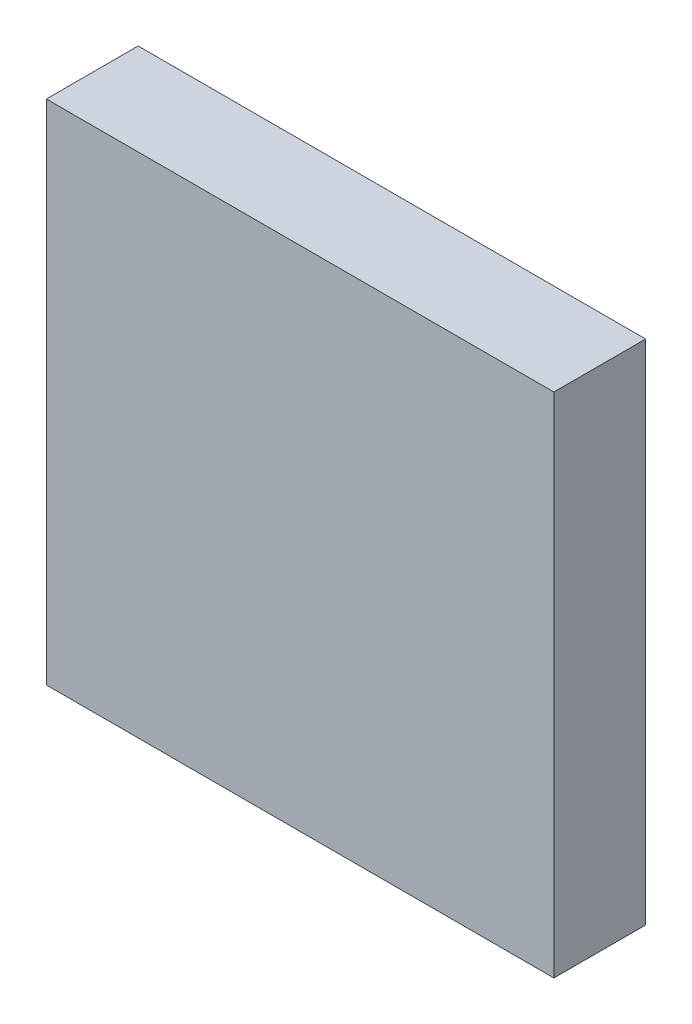
ISO-10303-21;
HEADER;
FILE_DESCRIPTION(('STEP AP214'),'2;1');
FILE_NAME('part.step','',(''),(''),'','','');
FILE_SCHEMA(('AUTOMOTIVE_DESIGN { 1 0 10303 214 1 1 1 1 }'));
ENDSEC;
DATA;
#1=APPLICATION_CONTEXT('core data for automotive mechanical design processes');
#2=APPLICATION_PROTOCOL_DEFINITION('international standard','automotive_design',2000,#1);
#3=PRODUCT_CONTEXT('',#1,'mechanical');
#4=PRODUCT('Part','Part','',(#3));
#5=PRODUCT_RELATED_PRODUCT_CATEGORY('part','',(#4));
#6=PRODUCT_DEFINITION_FORMATION('','',#4);
#7=PRODUCT_DEFINITION_CONTEXT('part definition',#1,'design');
#8=PRODUCT_DEFINITION('design','',#6,#7);
#9=PRODUCT_DEFINITION_SHAPE('','',#8);
#10=(LENGTH_UNIT() NAMED_UNIT(*) SI_UNIT(.MILLI.,.METRE.));
#11=(NAMED_UNIT(*) PLANE_ANGLE_UNIT() SI_UNIT($,.RADIAN.));
#12=(NAMED_UNIT(*) SI_UNIT($,.STERADIAN.) SOLID_ANGLE_UNIT());
#13=UNCERTAINTY_MEASURE_WITH_UNIT(LENGTH_MEASURE(1.E-05),#10,'distance_accuracy_value','');
#14=(GEOMETRIC_REPRESENTATION_CONTEXT(3) GLOBAL_UNCERTAINTY_ASSIGNED_CONTEXT((#13)) GLOBAL_UNIT_ASSIGNED_CONTEXT((#10,
#11,#12)) REPRESENTATION_CONTEXT('',''));
#15=CARTESIAN_POINT('',(0.,0.,0.));
#16=DIRECTION('',(0.,0.,1.));
#17=DIRECTION('',(1.,0.,0.));
#18=AXIS2_PLACEMENT_3D('',#15,#16,#17);
#19=CARTESIAN_POINT('',(-2.9032,-2.627,1.));
#20=DIRECTION('',(1.,0.,0.));
#21=DIRECTION('',(0.,0.,-1.));
#22=AXIS2_PLACEMENT_3D('',#19,#20,#21);
#23=PLANE('',#22);
#24=DIRECTION('',(0.,-1.,0.));
#25=VECTOR('',#24,1.);
#26=CARTESIAN_POINT('',(-2.9032,-2.627,0.));
#27=LINE('',#26,#25);
#28=CARTESIAN_POINT('',(-2.9032,2.9032,0.));
#29=VERTEX_POINT('',#28);
#30=CARTESIAN_POINT('',(-2.9032,-2.627,0.));
#31=VERTEX_POINT('',#30);
#32=EDGE_CURVE('E95',#29,#31,#27,.T.);
#33=ORIENTED_EDGE('',*,*,#32,.T.);
#34=DIRECTION('',(0.,0.,-1.));
#35=VECTOR('',#34,1.);
#36=CARTESIAN_POINT('',(-2.9032,-2.627,1.));
#37=LINE('',#36,#35);
#38=CARTESIAN_POINT('',(-2.9032,-2.627,1.));
#39=VERTEX_POINT('',#38);
#40=EDGE_CURVE('E11',#39,#31,#37,.T.);
#41=ORIENTED_EDGE('',*,*,#40,.F.);
#42=DIRECTION('',(0.,-1.,0.));
#43=VECTOR('',#42,1.);
#44=CARTESIAN_POINT('',(-2.9032,-2.627,1.));
#45=LINE('',#44,#43);
#46=CARTESIAN_POINT('',(-2.9032,2.9032,1.));
#47=VERTEX_POINT('',#46);
#48=EDGE_CURVE('E83',#47,#39,#45,.T.);
#49=ORIENTED_EDGE('',*,*,#48,.F.);
#50=DIRECTION('',(0.,0.,-1.));
#51=VECTOR('',#50,1.);
#52=CARTESIAN_POINT('',(-2.9032,2.9032,1.));
#53=LINE('',#52,#51);
#54=EDGE_CURVE('E91',#47,#29,#53,.T.);
#55=ORIENTED_EDGE('',*,*,#54,.T.);
#56=EDGE_LOOP('',(#33,#41,#49,#55));
#57=FACE_BOUND('',#56,.T.);
#58=ADVANCED_FACE('F32',(#57),#23,.F.);
#59=CARTESIAN_POINT('',(2.627,-2.627,1.));
#60=DIRECTION('',(0.,1.,0.));
#61=DIRECTION('',(0.,0.,1.));
#62=AXIS2_PLACEMENT_3D('',#59,#60,#61);
#63=PLANE('',#62);
#64=DIRECTION('',(1.,0.,0.));
#65=VECTOR('',#64,1.);
#66=CARTESIAN_POINT('',(2.627,-2.627,0.));
#67=LINE('',#66,#65);
#68=CARTESIAN_POINT('',(2.627,-2.627,0.));
#69=VERTEX_POINT('',#68);
#70=EDGE_CURVE('E87',#31,#69,#67,.T.);
#71=ORIENTED_EDGE('',*,*,#70,.T.);
#72=DIRECTION('',(0.,0.,-1.));
#73=VECTOR('',#72,1.);
#74=CARTESIAN_POINT('',(2.627,-2.627,1.));
#75=LINE('',#74,#73);
#76=CARTESIAN_POINT('',(2.627,-2.627,1.));
#77=VERTEX_POINT('',#76);
#78=EDGE_CURVE('E40',#77,#69,#75,.T.);
#79=ORIENTED_EDGE('',*,*,#78,.F.);
#80=DIRECTION('',(1.,0.,0.));
#81=VECTOR('',#80,1.);
#82=CARTESIAN_POINT('',(2.627,-2.627,1.));
#83=LINE('',#82,#81);
#84=EDGE_CURVE('E78',#39,#77,#83,.T.);
#85=ORIENTED_EDGE('',*,*,#84,.F.);
#86=ORIENTED_EDGE('',*,*,#40,.T.);
#87=EDGE_LOOP('',(#71,#79,#85,#86));
#88=FACE_BOUND('',#87,.T.);
#89=ADVANCED_FACE('F86',(#88),#63,.F.);
#90=CARTESIAN_POINT('',(2.627,2.9032,1.));
#91=DIRECTION('',(-1.,0.,0.));
#92=DIRECTION('',(0.,0.,1.));
#93=AXIS2_PLACEMENT_3D('',#90,#91,#92);
#94=PLANE('',#93);
#95=DIRECTION('',(0.,1.,0.));
#96=VECTOR('',#95,1.);
#97=CARTESIAN_POINT('',(2.627,2.9032,0.));
#98=LINE('',#97,#96);
#99=CARTESIAN_POINT('',(2.627,2.9032,0.));
#100=VERTEX_POINT('',#99);
#101=EDGE_CURVE('E65',#69,#100,#98,.T.);
#102=ORIENTED_EDGE('',*,*,#101,.T.);
#103=DIRECTION('',(0.,0.,-1.));
#104=VECTOR('',#103,1.);
#105=CARTESIAN_POINT('',(2.627,2.9032,1.));
#106=LINE('',#105,#104);
#107=CARTESIAN_POINT('',(2.627,2.9032,1.));
#108=VERTEX_POINT('',#107);
#109=EDGE_CURVE('E88',#108,#100,#106,.T.);
#110=ORIENTED_EDGE('',*,*,#109,.F.);
#111=DIRECTION('',(0.,1.,0.));
#112=VECTOR('',#111,1.);
#113=CARTESIAN_POINT('',(2.627,2.9032,1.));
#114=LINE('',#113,#112);
#115=EDGE_CURVE('E81',#77,#108,#114,.T.);
#116=ORIENTED_EDGE('',*,*,#115,.F.);
#117=ORIENTED_EDGE('',*,*,#78,.T.);
#118=EDGE_LOOP('',(#102,#110,#116,#117));
#119=FACE_BOUND('',#118,.T.);
#120=ADVANCED_FACE('F89',(#119),#94,.F.);
#121=CARTESIAN_POINT('',(-2.9032,2.9032,1.));
#122=DIRECTION('',(0.,-1.,0.));
#123=DIRECTION('',(0.,0.,-1.));
#124=AXIS2_PLACEMENT_3D('',#121,#122,#123);
#125=PLANE('',#124);
#126=DIRECTION('',(-1.,0.,0.));
#127=VECTOR('',#126,1.);
#128=CARTESIAN_POINT('',(-2.9032,2.9032,0.));
#129=LINE('',#128,#127);
#130=EDGE_CURVE('E71',#100,#29,#129,.T.);
#131=ORIENTED_EDGE('',*,*,#130,.T.);
#132=ORIENTED_EDGE('',*,*,#54,.F.);
#133=DIRECTION('',(-1.,0.,0.));
#134=VECTOR('',#133,1.);
#135=CARTESIAN_POINT('',(-2.9032,2.9032,1.));
#136=LINE('',#135,#134);
#137=EDGE_CURVE('E48',#108,#47,#136,.T.);
#138=ORIENTED_EDGE('',*,*,#137,.F.);
#139=ORIENTED_EDGE('',*,*,#109,.T.);
#140=EDGE_LOOP('',(#131,#132,#138,#139));
#141=FACE_BOUND('',#140,.T.);
#142=ADVANCED_FACE('F102',(#141),#125,.F.);
#143=CARTESIAN_POINT('',(0.,0.,1.));
#144=DIRECTION('',(0.,0.,-1.));
#145=DIRECTION('',(-1.,0.,0.));
#146=AXIS2_PLACEMENT_3D('',#143,#144,#145);
#147=PLANE('',#146);
#148=ORIENTED_EDGE('',*,*,#48,.T.);
#149=ORIENTED_EDGE('',*,*,#84,.T.);
#150=ORIENTED_EDGE('',*,*,#115,.T.);
#151=ORIENTED_EDGE('',*,*,#137,.T.);
#152=EDGE_LOOP('',(#148,#149,#150,#151));
#153=FACE_BOUND('',#152,.T.);
#154=ADVANCED_FACE('F79',(#153),#147,.F.);
#155=CARTESIAN_POINT('',(0.,0.,0.));
#156=DIRECTION('',(0.,0.,-1.));
#157=DIRECTION('',(-1.,0.,0.));
#158=AXIS2_PLACEMENT_3D('',#155,#156,#157);
#159=PLANE('',#158);
#160=ORIENTED_EDGE('',*,*,#32,.F.);
#161=ORIENTED_EDGE('',*,*,#130,.F.);
#162=ORIENTED_EDGE('',*,*,#101,.F.);
#163=ORIENTED_EDGE('',*,*,#70,.F.);
#164=EDGE_LOOP('',(#160,#161,#162,#163));
#165=FACE_BOUND('',#164,.T.);
#166=ADVANCED_FACE('F105',(#165),#159,.T.);
#167=CLOSED_SHELL('',(#58,#89,#120,#142,#154,#166));
#168=MANIFOLD_SOLID_BREP('B2',#167);
#169=ADVANCED_BREP_SHAPE_REPRESENTATION('',(#18,#168),#14);
#170=SHAPE_DEFINITION_REPRESENTATION(#9,#169);
ENDSEC;
END-ISO-10303-21;
